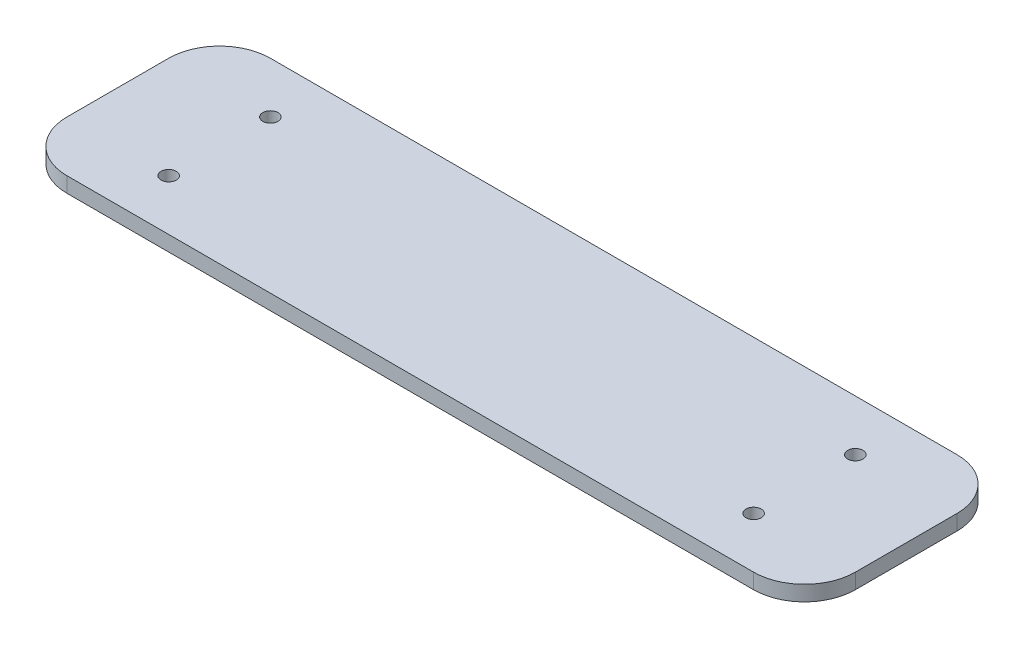
ISO-10303-21;
HEADER;
FILE_DESCRIPTION(('STEP AP214'),'2;1');
FILE_NAME('part.step','',(''),(''),'','','');
FILE_SCHEMA(('AUTOMOTIVE_DESIGN { 1 0 10303 214 1 1 1 1 }'));
ENDSEC;
DATA;
#1=APPLICATION_CONTEXT('core data for automotive mechanical design processes');
#2=APPLICATION_PROTOCOL_DEFINITION('international standard','automotive_design',2000,#1);
#3=PRODUCT_CONTEXT('',#1,'mechanical');
#4=PRODUCT('Part','Part','',(#3));
#5=PRODUCT_RELATED_PRODUCT_CATEGORY('part','',(#4));
#6=PRODUCT_DEFINITION_FORMATION('','',#4);
#7=PRODUCT_DEFINITION_CONTEXT('part definition',#1,'design');
#8=PRODUCT_DEFINITION('design','',#6,#7);
#9=PRODUCT_DEFINITION_SHAPE('','',#8);
#10=(LENGTH_UNIT() NAMED_UNIT(*) SI_UNIT(.MILLI.,.METRE.));
#11=(NAMED_UNIT(*) PLANE_ANGLE_UNIT() SI_UNIT($,.RADIAN.));
#12=(NAMED_UNIT(*) SI_UNIT($,.STERADIAN.) SOLID_ANGLE_UNIT());
#13=UNCERTAINTY_MEASURE_WITH_UNIT(LENGTH_MEASURE(1.E-05),#10,'distance_accuracy_value','');
#14=(GEOMETRIC_REPRESENTATION_CONTEXT(3) GLOBAL_UNCERTAINTY_ASSIGNED_CONTEXT((#13)) GLOBAL_UNIT_ASSIGNED_CONTEXT((#10,
#11,#12)) REPRESENTATION_CONTEXT('',''));
#15=CARTESIAN_POINT('',(0.,0.,0.));
#16=DIRECTION('',(0.,0.,1.));
#17=DIRECTION('',(1.,0.,0.));
#18=AXIS2_PLACEMENT_3D('',#15,#16,#17);
#19=CARTESIAN_POINT('',(0.,3.,0.));
#20=DIRECTION('',(0.,1.,0.));
#21=DIRECTION('',(0.,0.,1.));
#22=AXIS2_PLACEMENT_3D('',#19,#20,#21);
#23=PLANE('',#22);
#24=CARTESIAN_POINT('',(57.5,3.,9.99999999999999));
#25=DIRECTION('',(0.,1.,0.));
#26=DIRECTION('',(0.,0.,1.));
#27=AXIS2_PLACEMENT_3D('',#24,#25,#26);
#28=CIRCLE('',#27,1.5);
#29=CARTESIAN_POINT('',(57.5,3.,11.5));
#30=VERTEX_POINT('',#29);
#31=EDGE_CURVE('E257',#30,#30,#28,.T.);
#32=ORIENTED_EDGE('',*,*,#31,.F.);
#33=EDGE_LOOP('',(#32));
#34=FACE_BOUND('',#33,.T.);
#35=CARTESIAN_POINT('',(-57.5,3.,-10.));
#36=DIRECTION('',(0.,1.,0.));
#37=DIRECTION('',(0.,0.,1.));
#38=AXIS2_PLACEMENT_3D('',#35,#36,#37);
#39=CIRCLE('',#38,1.5);
#40=CARTESIAN_POINT('',(-57.5,3.,-8.5));
#41=VERTEX_POINT('',#40);
#42=EDGE_CURVE('E193',#41,#41,#39,.T.);
#43=ORIENTED_EDGE('',*,*,#42,.F.);
#44=EDGE_LOOP('',(#43));
#45=FACE_BOUND('',#44,.T.);
#46=DIRECTION('',(0.,0.,1.));
#47=VECTOR('',#46,1.);
#48=CARTESIAN_POINT('',(-77.5,3.,-20.));
#49=LINE('',#48,#47);
#50=CARTESIAN_POINT('',(-77.5,3.,-10.));
#51=VERTEX_POINT('',#50);
#52=CARTESIAN_POINT('',(-77.5,3.,10.));
#53=VERTEX_POINT('',#52);
#54=EDGE_CURVE('E181',#51,#53,#49,.T.);
#55=ORIENTED_EDGE('',*,*,#54,.T.);
#56=CARTESIAN_POINT('',(-67.5,3.,10.));
#57=DIRECTION('',(0.,1.,0.));
#58=DIRECTION('',(0.,0.,1.));
#59=AXIS2_PLACEMENT_3D('',#56,#57,#58);
#60=CIRCLE('',#59,10.);
#61=CARTESIAN_POINT('',(-67.5,3.,20.));
#62=VERTEX_POINT('',#61);
#63=EDGE_CURVE('E169',#53,#62,#60,.T.);
#64=ORIENTED_EDGE('',*,*,#63,.T.);
#65=DIRECTION('',(1.,0.,0.));
#66=VECTOR('',#65,1.);
#67=CARTESIAN_POINT('',(-77.5,3.,20.));
#68=LINE('',#67,#66);
#69=CARTESIAN_POINT('',(67.5,3.,20.));
#70=VERTEX_POINT('',#69);
#71=EDGE_CURVE('E127',#62,#70,#68,.T.);
#72=ORIENTED_EDGE('',*,*,#71,.T.);
#73=CARTESIAN_POINT('',(67.5,3.,10.));
#74=DIRECTION('',(0.,1.,0.));
#75=DIRECTION('',(0.,0.,1.));
#76=AXIS2_PLACEMENT_3D('',#73,#74,#75);
#77=CIRCLE('',#76,10.);
#78=CARTESIAN_POINT('',(77.5,3.,10.));
#79=VERTEX_POINT('',#78);
#80=EDGE_CURVE('E166',#70,#79,#77,.T.);
#81=ORIENTED_EDGE('',*,*,#80,.T.);
#82=DIRECTION('',(0.,0.,-1.));
#83=VECTOR('',#82,1.);
#84=CARTESIAN_POINT('',(77.5,3.,-20.));
#85=LINE('',#84,#83);
#86=CARTESIAN_POINT('',(77.5,3.,-10.));
#87=VERTEX_POINT('',#86);
#88=EDGE_CURVE('E136',#79,#87,#85,.T.);
#89=ORIENTED_EDGE('',*,*,#88,.T.);
#90=CARTESIAN_POINT('',(67.5,3.,-10.));
#91=DIRECTION('',(0.,1.,0.));
#92=DIRECTION('',(0.,0.,1.));
#93=AXIS2_PLACEMENT_3D('',#90,#91,#92);
#94=CIRCLE('',#93,10.);
#95=CARTESIAN_POINT('',(67.5,3.,-20.));
#96=VERTEX_POINT('',#95);
#97=EDGE_CURVE('E61',#87,#96,#94,.T.);
#98=ORIENTED_EDGE('',*,*,#97,.T.);
#99=DIRECTION('',(-1.,0.,0.));
#100=VECTOR('',#99,1.);
#101=CARTESIAN_POINT('',(-77.5,3.,-20.));
#102=LINE('',#101,#100);
#103=CARTESIAN_POINT('',(-67.5,3.,-20.));
#104=VERTEX_POINT('',#103);
#105=EDGE_CURVE('E141',#96,#104,#102,.T.);
#106=ORIENTED_EDGE('',*,*,#105,.T.);
#107=CARTESIAN_POINT('',(-67.5,3.,-10.));
#108=DIRECTION('',(0.,1.,0.));
#109=DIRECTION('',(0.,0.,1.));
#110=AXIS2_PLACEMENT_3D('',#107,#108,#109);
#111=CIRCLE('',#110,10.);
#112=EDGE_CURVE('E161',#104,#51,#111,.T.);
#113=ORIENTED_EDGE('',*,*,#112,.T.);
#114=EDGE_LOOP('',(#55,#64,#72,#81,#89,#98,#106,#113));
#115=FACE_BOUND('',#114,.T.);
#116=CARTESIAN_POINT('',(-57.5,3.,9.99999999999999));
#117=DIRECTION('',(0.,1.,0.));
#118=DIRECTION('',(0.,0.,1.));
#119=AXIS2_PLACEMENT_3D('',#116,#117,#118);
#120=CIRCLE('',#119,1.5);
#121=CARTESIAN_POINT('',(-57.5,3.,11.5));
#122=VERTEX_POINT('',#121);
#123=EDGE_CURVE('E265',#122,#122,#120,.T.);
#124=ORIENTED_EDGE('',*,*,#123,.F.);
#125=EDGE_LOOP('',(#124));
#126=FACE_BOUND('',#125,.T.);
#127=CARTESIAN_POINT('',(57.5,3.,-10.));
#128=DIRECTION('',(0.,1.,0.));
#129=DIRECTION('',(0.,0.,1.));
#130=AXIS2_PLACEMENT_3D('',#127,#128,#129);
#131=CIRCLE('',#130,1.5);
#132=CARTESIAN_POINT('',(57.5,3.,-8.5));
#133=VERTEX_POINT('',#132);
#134=EDGE_CURVE('E246',#133,#133,#131,.T.);
#135=ORIENTED_EDGE('',*,*,#134,.F.);
#136=EDGE_LOOP('',(#135));
#137=FACE_BOUND('',#136,.T.);
#138=ADVANCED_FACE('F39',(#34,#45,#115,#126,#137),#23,.T.);
#139=CARTESIAN_POINT('',(0.,0.,0.));
#140=DIRECTION('',(0.,1.,0.));
#141=DIRECTION('',(0.,0.,1.));
#142=AXIS2_PLACEMENT_3D('',#139,#140,#141);
#143=PLANE('',#142);
#144=DIRECTION('',(1.,0.,0.));
#145=VECTOR('',#144,1.);
#146=CARTESIAN_POINT('',(-77.5,0.,20.));
#147=LINE('',#146,#145);
#148=CARTESIAN_POINT('',(-67.5,0.,20.));
#149=VERTEX_POINT('',#148);
#150=CARTESIAN_POINT('',(67.5,0.,20.));
#151=VERTEX_POINT('',#150);
#152=EDGE_CURVE('E124',#149,#151,#147,.T.);
#153=ORIENTED_EDGE('',*,*,#152,.F.);
#154=CARTESIAN_POINT('',(-67.5,0.,10.));
#155=DIRECTION('',(0.,1.,0.));
#156=DIRECTION('',(0.,0.,1.));
#157=AXIS2_PLACEMENT_3D('',#154,#155,#156);
#158=CIRCLE('',#157,10.);
#159=CARTESIAN_POINT('',(-77.5,0.,10.));
#160=VERTEX_POINT('',#159);
#161=EDGE_CURVE('E106',#149,#160,#158,.F.);
#162=ORIENTED_EDGE('',*,*,#161,.T.);
#163=DIRECTION('',(0.,0.,1.));
#164=VECTOR('',#163,1.);
#165=CARTESIAN_POINT('',(-77.5,0.,-20.));
#166=LINE('',#165,#164);
#167=CARTESIAN_POINT('',(-77.5,0.,-10.));
#168=VERTEX_POINT('',#167);
#169=EDGE_CURVE('E137',#168,#160,#166,.T.);
#170=ORIENTED_EDGE('',*,*,#169,.F.);
#171=CARTESIAN_POINT('',(-67.5,0.,-10.));
#172=DIRECTION('',(0.,1.,0.));
#173=DIRECTION('',(0.,0.,1.));
#174=AXIS2_PLACEMENT_3D('',#171,#172,#173);
#175=CIRCLE('',#174,10.);
#176=CARTESIAN_POINT('',(-67.5,0.,-20.));
#177=VERTEX_POINT('',#176);
#178=EDGE_CURVE('E129',#168,#177,#175,.F.);
#179=ORIENTED_EDGE('',*,*,#178,.T.);
#180=DIRECTION('',(-1.,0.,0.));
#181=VECTOR('',#180,1.);
#182=CARTESIAN_POINT('',(-77.5,0.,-20.));
#183=LINE('',#182,#181);
#184=CARTESIAN_POINT('',(67.5,0.,-20.));
#185=VERTEX_POINT('',#184);
#186=EDGE_CURVE('E143',#185,#177,#183,.T.);
#187=ORIENTED_EDGE('',*,*,#186,.F.);
#188=CARTESIAN_POINT('',(67.5,0.,-10.));
#189=DIRECTION('',(0.,1.,0.));
#190=DIRECTION('',(0.,0.,1.));
#191=AXIS2_PLACEMENT_3D('',#188,#189,#190);
#192=CIRCLE('',#191,10.);
#193=CARTESIAN_POINT('',(77.5,0.,-10.));
#194=VERTEX_POINT('',#193);
#195=EDGE_CURVE('E151',#185,#194,#192,.F.);
#196=ORIENTED_EDGE('',*,*,#195,.T.);
#197=DIRECTION('',(0.,0.,-1.));
#198=VECTOR('',#197,1.);
#199=CARTESIAN_POINT('',(77.5,0.,-20.));
#200=LINE('',#199,#198);
#201=CARTESIAN_POINT('',(77.5,0.,10.));
#202=VERTEX_POINT('',#201);
#203=EDGE_CURVE('E190',#202,#194,#200,.T.);
#204=ORIENTED_EDGE('',*,*,#203,.F.);
#205=CARTESIAN_POINT('',(67.5,0.,10.));
#206=DIRECTION('',(0.,1.,0.));
#207=DIRECTION('',(0.,0.,1.));
#208=AXIS2_PLACEMENT_3D('',#205,#206,#207);
#209=CIRCLE('',#208,10.);
#210=EDGE_CURVE('E118',#202,#151,#209,.F.);
#211=ORIENTED_EDGE('',*,*,#210,.T.);
#212=EDGE_LOOP('',(#153,#162,#170,#179,#187,#196,#204,#211));
#213=FACE_BOUND('',#212,.T.);
#214=CARTESIAN_POINT('',(-57.5,0.,-10.));
#215=DIRECTION('',(0.,1.,0.));
#216=DIRECTION('',(0.,0.,1.));
#217=AXIS2_PLACEMENT_3D('',#214,#215,#216);
#218=CIRCLE('',#217,1.5);
#219=CARTESIAN_POINT('',(-57.5,0.,-8.5));
#220=VERTEX_POINT('',#219);
#221=EDGE_CURVE('E269',#220,#220,#218,.T.);
#222=ORIENTED_EDGE('',*,*,#221,.T.);
#223=EDGE_LOOP('',(#222));
#224=FACE_BOUND('',#223,.T.);
#225=CARTESIAN_POINT('',(-57.5,0.,9.99999999999999));
#226=DIRECTION('',(0.,1.,0.));
#227=DIRECTION('',(0.,0.,1.));
#228=AXIS2_PLACEMENT_3D('',#225,#226,#227);
#229=CIRCLE('',#228,1.5);
#230=CARTESIAN_POINT('',(-57.5,0.,11.5));
#231=VERTEX_POINT('',#230);
#232=EDGE_CURVE('E261',#231,#231,#229,.T.);
#233=ORIENTED_EDGE('',*,*,#232,.T.);
#234=EDGE_LOOP('',(#233));
#235=FACE_BOUND('',#234,.T.);
#236=CARTESIAN_POINT('',(57.5,0.,9.99999999999999));
#237=DIRECTION('',(0.,1.,0.));
#238=DIRECTION('',(0.,0.,1.));
#239=AXIS2_PLACEMENT_3D('',#236,#237,#238);
#240=CIRCLE('',#239,1.5);
#241=CARTESIAN_POINT('',(57.5,0.,11.5));
#242=VERTEX_POINT('',#241);
#243=EDGE_CURVE('E254',#242,#242,#240,.T.);
#244=ORIENTED_EDGE('',*,*,#243,.T.);
#245=EDGE_LOOP('',(#244));
#246=FACE_BOUND('',#245,.T.);
#247=CARTESIAN_POINT('',(57.5,0.,-10.));
#248=DIRECTION('',(0.,1.,0.));
#249=DIRECTION('',(0.,0.,1.));
#250=AXIS2_PLACEMENT_3D('',#247,#248,#249);
#251=CIRCLE('',#250,1.5);
#252=CARTESIAN_POINT('',(57.5,0.,-8.5));
#253=VERTEX_POINT('',#252);
#254=EDGE_CURVE('E249',#253,#253,#251,.T.);
#255=ORIENTED_EDGE('',*,*,#254,.T.);
#256=EDGE_LOOP('',(#255));
#257=FACE_BOUND('',#256,.T.);
#258=ADVANCED_FACE('F132',(#213,#224,#235,#246,#257),#143,.F.);
#259=CARTESIAN_POINT('',(77.5,3.,-20.));
#260=DIRECTION('',(-1.,0.,0.));
#261=DIRECTION('',(0.,0.,1.));
#262=AXIS2_PLACEMENT_3D('',#259,#260,#261);
#263=PLANE('',#262);
#264=ORIENTED_EDGE('',*,*,#88,.F.);
#265=DIRECTION('',(0.,-1.,0.));
#266=VECTOR('',#265,1.);
#267=CARTESIAN_POINT('',(77.5,3.,10.));
#268=LINE('',#267,#266);
#269=EDGE_CURVE('E175',#79,#202,#268,.T.);
#270=ORIENTED_EDGE('',*,*,#269,.T.);
#271=ORIENTED_EDGE('',*,*,#203,.T.);
#272=DIRECTION('',(0.,-1.,0.));
#273=VECTOR('',#272,1.);
#274=CARTESIAN_POINT('',(77.5,3.,-10.));
#275=LINE('',#274,#273);
#276=EDGE_CURVE('E172',#194,#87,#275,.F.);
#277=ORIENTED_EDGE('',*,*,#276,.T.);
#278=EDGE_LOOP('',(#264,#270,#271,#277));
#279=FACE_BOUND('',#278,.T.);
#280=ADVANCED_FACE('F212',(#279),#263,.F.);
#281=CARTESIAN_POINT('',(-77.5,3.,-20.));
#282=DIRECTION('',(0.,0.,1.));
#283=DIRECTION('',(1.,0.,0.));
#284=AXIS2_PLACEMENT_3D('',#281,#282,#283);
#285=PLANE('',#284);
#286=ORIENTED_EDGE('',*,*,#105,.F.);
#287=DIRECTION('',(0.,-1.,0.));
#288=VECTOR('',#287,1.);
#289=CARTESIAN_POINT('',(67.5,3.,-20.));
#290=LINE('',#289,#288);
#291=EDGE_CURVE('E11',#96,#185,#290,.T.);
#292=ORIENTED_EDGE('',*,*,#291,.T.);
#293=ORIENTED_EDGE('',*,*,#186,.T.);
#294=DIRECTION('',(0.,-1.,0.));
#295=VECTOR('',#294,1.);
#296=CARTESIAN_POINT('',(-67.5,3.,-20.));
#297=LINE('',#296,#295);
#298=EDGE_CURVE('E48',#177,#104,#297,.F.);
#299=ORIENTED_EDGE('',*,*,#298,.T.);
#300=EDGE_LOOP('',(#286,#292,#293,#299));
#301=FACE_BOUND('',#300,.T.);
#302=ADVANCED_FACE('F196',(#301),#285,.F.);
#303=CARTESIAN_POINT('',(-77.5,3.,-20.));
#304=DIRECTION('',(1.,0.,0.));
#305=DIRECTION('',(0.,0.,-1.));
#306=AXIS2_PLACEMENT_3D('',#303,#304,#305);
#307=PLANE('',#306);
#308=ORIENTED_EDGE('',*,*,#169,.T.);
#309=DIRECTION('',(0.,-1.,0.));
#310=VECTOR('',#309,1.);
#311=CARTESIAN_POINT('',(-77.5,3.,10.));
#312=LINE('',#311,#310);
#313=EDGE_CURVE('E111',#160,#53,#312,.F.);
#314=ORIENTED_EDGE('',*,*,#313,.T.);
#315=ORIENTED_EDGE('',*,*,#54,.F.);
#316=DIRECTION('',(0.,-1.,0.));
#317=VECTOR('',#316,1.);
#318=CARTESIAN_POINT('',(-77.5,3.,-10.));
#319=LINE('',#318,#317);
#320=EDGE_CURVE('E117',#51,#168,#319,.T.);
#321=ORIENTED_EDGE('',*,*,#320,.T.);
#322=EDGE_LOOP('',(#308,#314,#315,#321));
#323=FACE_BOUND('',#322,.T.);
#324=ADVANCED_FACE('F203',(#323),#307,.F.);
#325=CARTESIAN_POINT('',(-77.5,3.,20.));
#326=DIRECTION('',(0.,0.,-1.));
#327=DIRECTION('',(-1.,0.,0.));
#328=AXIS2_PLACEMENT_3D('',#325,#326,#327);
#329=PLANE('',#328);
#330=ORIENTED_EDGE('',*,*,#71,.F.);
#331=DIRECTION('',(0.,-1.,0.));
#332=VECTOR('',#331,1.);
#333=CARTESIAN_POINT('',(-67.5,3.,20.));
#334=LINE('',#333,#332);
#335=EDGE_CURVE('E110',#62,#149,#334,.T.);
#336=ORIENTED_EDGE('',*,*,#335,.T.);
#337=ORIENTED_EDGE('',*,*,#152,.T.);
#338=DIRECTION('',(0.,-1.,0.));
#339=VECTOR('',#338,1.);
#340=CARTESIAN_POINT('',(67.5,3.,20.));
#341=LINE('',#340,#339);
#342=EDGE_CURVE('E130',#151,#70,#341,.F.);
#343=ORIENTED_EDGE('',*,*,#342,.T.);
#344=EDGE_LOOP('',(#330,#336,#337,#343));
#345=FACE_BOUND('',#344,.T.);
#346=ADVANCED_FACE('F123',(#345),#329,.F.);
#347=CARTESIAN_POINT('',(-57.5,3.,-10.));
#348=DIRECTION('',(0.,-1.,0.));
#349=DIRECTION('',(0.,0.,-1.));
#350=AXIS2_PLACEMENT_3D('',#347,#348,#349);
#351=CYLINDRICAL_SURFACE('',#350,1.5);
#352=ORIENTED_EDGE('',*,*,#42,.T.);
#353=EDGE_LOOP('',(#352));
#354=FACE_BOUND('',#353,.T.);
#355=ORIENTED_EDGE('',*,*,#221,.F.);
#356=EDGE_LOOP('',(#355));
#357=FACE_BOUND('',#356,.T.);
#358=ADVANCED_FACE('F210',(#354,#357),#351,.F.);
#359=CARTESIAN_POINT('',(-57.5,3.,9.99999999999999));
#360=DIRECTION('',(0.,-1.,0.));
#361=DIRECTION('',(0.,0.,-1.));
#362=AXIS2_PLACEMENT_3D('',#359,#360,#361);
#363=CYLINDRICAL_SURFACE('',#362,1.5);
#364=ORIENTED_EDGE('',*,*,#123,.T.);
#365=EDGE_LOOP('',(#364));
#366=FACE_BOUND('',#365,.T.);
#367=ORIENTED_EDGE('',*,*,#232,.F.);
#368=EDGE_LOOP('',(#367));
#369=FACE_BOUND('',#368,.T.);
#370=ADVANCED_FACE('F226',(#366,#369),#363,.F.);
#371=CARTESIAN_POINT('',(57.5,3.,9.99999999999999));
#372=DIRECTION('',(0.,-1.,0.));
#373=DIRECTION('',(0.,0.,-1.));
#374=AXIS2_PLACEMENT_3D('',#371,#372,#373);
#375=CYLINDRICAL_SURFACE('',#374,1.5);
#376=ORIENTED_EDGE('',*,*,#31,.T.);
#377=EDGE_LOOP('',(#376));
#378=FACE_BOUND('',#377,.T.);
#379=ORIENTED_EDGE('',*,*,#243,.F.);
#380=EDGE_LOOP('',(#379));
#381=FACE_BOUND('',#380,.T.);
#382=ADVANCED_FACE('F230',(#378,#381),#375,.F.);
#383=CARTESIAN_POINT('',(57.5,3.,-10.));
#384=DIRECTION('',(0.,-1.,0.));
#385=DIRECTION('',(0.,0.,-1.));
#386=AXIS2_PLACEMENT_3D('',#383,#384,#385);
#387=CYLINDRICAL_SURFACE('',#386,1.5);
#388=ORIENTED_EDGE('',*,*,#134,.T.);
#389=EDGE_LOOP('',(#388));
#390=FACE_BOUND('',#389,.T.);
#391=ORIENTED_EDGE('',*,*,#254,.F.);
#392=EDGE_LOOP('',(#391));
#393=FACE_BOUND('',#392,.T.);
#394=ADVANCED_FACE('F234',(#390,#393),#387,.F.);
#395=CARTESIAN_POINT('',(-67.5,3.,10.));
#396=DIRECTION('',(0.,-1.,0.));
#397=DIRECTION('',(0.,0.,-1.));
#398=AXIS2_PLACEMENT_3D('',#395,#396,#397);
#399=CYLINDRICAL_SURFACE('',#398,10.);
#400=ORIENTED_EDGE('',*,*,#63,.F.);
#401=ORIENTED_EDGE('',*,*,#313,.F.);
#402=ORIENTED_EDGE('',*,*,#161,.F.);
#403=ORIENTED_EDGE('',*,*,#335,.F.);
#404=EDGE_LOOP('',(#400,#401,#402,#403));
#405=FACE_BOUND('',#404,.T.);
#406=ADVANCED_FACE('F109',(#405),#399,.T.);
#407=CARTESIAN_POINT('',(67.5,3.,10.));
#408=DIRECTION('',(0.,-1.,0.));
#409=DIRECTION('',(0.,0.,-1.));
#410=AXIS2_PLACEMENT_3D('',#407,#408,#409);
#411=CYLINDRICAL_SURFACE('',#410,10.);
#412=ORIENTED_EDGE('',*,*,#80,.F.);
#413=ORIENTED_EDGE('',*,*,#342,.F.);
#414=ORIENTED_EDGE('',*,*,#210,.F.);
#415=ORIENTED_EDGE('',*,*,#269,.F.);
#416=EDGE_LOOP('',(#412,#413,#414,#415));
#417=FACE_BOUND('',#416,.T.);
#418=ADVANCED_FACE('F241',(#417),#411,.T.);
#419=CARTESIAN_POINT('',(67.5,3.,-10.));
#420=DIRECTION('',(0.,-1.,0.));
#421=DIRECTION('',(0.,0.,-1.));
#422=AXIS2_PLACEMENT_3D('',#419,#420,#421);
#423=CYLINDRICAL_SURFACE('',#422,10.);
#424=ORIENTED_EDGE('',*,*,#97,.F.);
#425=ORIENTED_EDGE('',*,*,#276,.F.);
#426=ORIENTED_EDGE('',*,*,#195,.F.);
#427=ORIENTED_EDGE('',*,*,#291,.F.);
#428=EDGE_LOOP('',(#424,#425,#426,#427));
#429=FACE_BOUND('',#428,.T.);
#430=ADVANCED_FACE('F291',(#429),#423,.T.);
#431=CARTESIAN_POINT('',(-67.5,3.,-10.));
#432=DIRECTION('',(0.,-1.,0.));
#433=DIRECTION('',(0.,0.,-1.));
#434=AXIS2_PLACEMENT_3D('',#431,#432,#433);
#435=CYLINDRICAL_SURFACE('',#434,10.);
#436=ORIENTED_EDGE('',*,*,#112,.F.);
#437=ORIENTED_EDGE('',*,*,#298,.F.);
#438=ORIENTED_EDGE('',*,*,#178,.F.);
#439=ORIENTED_EDGE('',*,*,#320,.F.);
#440=EDGE_LOOP('',(#436,#437,#438,#439));
#441=FACE_BOUND('',#440,.T.);
#442=ADVANCED_FACE('F41',(#441),#435,.T.);
#443=CLOSED_SHELL('',(#138,#258,#280,#302,#324,#346,#358,#370,#382,#394,#406,#418,#430,#442));
#444=MANIFOLD_SOLID_BREP('B2',#443);
#445=ADVANCED_BREP_SHAPE_REPRESENTATION('',(#18,#444),#14);
#446=SHAPE_DEFINITION_REPRESENTATION(#9,#445);
ENDSEC;
END-ISO-10303-21;
